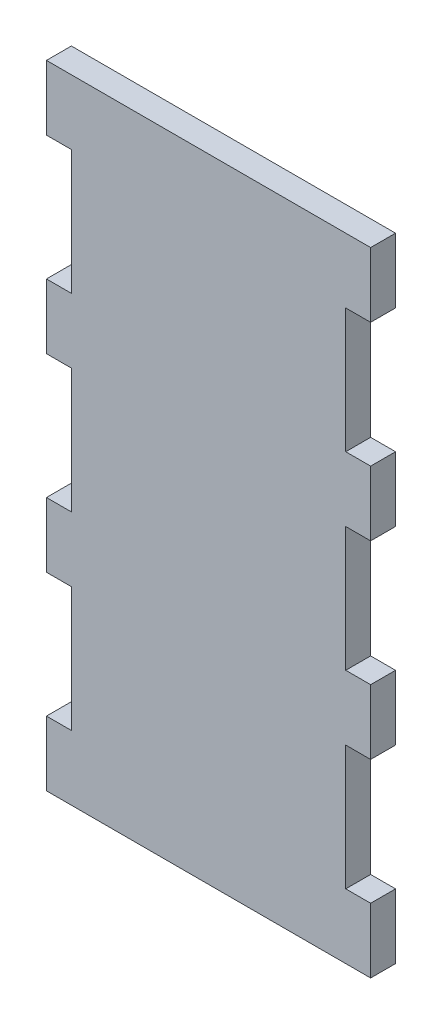
ISO-10303-21;
HEADER;
FILE_DESCRIPTION(('STEP AP214'),'2;1');
FILE_NAME('part.step','',(''),(''),'','','');
FILE_SCHEMA(('AUTOMOTIVE_DESIGN { 1 0 10303 214 1 1 1 1 }'));
ENDSEC;
DATA;
#1=APPLICATION_CONTEXT('core data for automotive mechanical design processes');
#2=APPLICATION_PROTOCOL_DEFINITION('international standard','automotive_design',2000,#1);
#3=PRODUCT_CONTEXT('',#1,'mechanical');
#4=PRODUCT('Part','Part','',(#3));
#5=PRODUCT_RELATED_PRODUCT_CATEGORY('part','',(#4));
#6=PRODUCT_DEFINITION_FORMATION('','',#4);
#7=PRODUCT_DEFINITION_CONTEXT('part definition',#1,'design');
#8=PRODUCT_DEFINITION('design','',#6,#7);
#9=PRODUCT_DEFINITION_SHAPE('','',#8);
#10=(LENGTH_UNIT() NAMED_UNIT(*) SI_UNIT(.MILLI.,.METRE.));
#11=(NAMED_UNIT(*) PLANE_ANGLE_UNIT() SI_UNIT($,.RADIAN.));
#12=(NAMED_UNIT(*) SI_UNIT($,.STERADIAN.) SOLID_ANGLE_UNIT());
#13=UNCERTAINTY_MEASURE_WITH_UNIT(LENGTH_MEASURE(1.E-05),#10,'distance_accuracy_value','');
#14=(GEOMETRIC_REPRESENTATION_CONTEXT(3) GLOBAL_UNCERTAINTY_ASSIGNED_CONTEXT((#13)) GLOBAL_UNIT_ASSIGNED_CONTEXT((#10,
#11,#12)) REPRESENTATION_CONTEXT('',''));
#15=CARTESIAN_POINT('',(0.,0.,0.));
#16=DIRECTION('',(0.,0.,1.));
#17=DIRECTION('',(1.,0.,0.));
#18=AXIS2_PLACEMENT_3D('',#15,#16,#17);
#19=CARTESIAN_POINT('',(-1.94346064814815,16.5420138888889,3.));
#20=DIRECTION('',(-1.,0.,0.));
#21=DIRECTION('',(0.,-1.,0.));
#22=AXIS2_PLACEMENT_3D('',#19,#20,#21);
#23=PLANE('',#22);
#24=DIRECTION('',(0.,1.,0.));
#25=VECTOR('',#24,1.);
#26=CARTESIAN_POINT('',(-1.94346064814815,16.5420138888889,0.));
#27=LINE('',#26,#25);
#28=CARTESIAN_POINT('',(-1.94346064814816,-36.8579861111111,0.));
#29=VERTEX_POINT('',#28);
#30=CARTESIAN_POINT('',(-1.94346064814816,-29.0579861111111,0.));
#31=VERTEX_POINT('',#30);
#32=EDGE_CURVE('E237',#29,#31,#27,.T.);
#33=ORIENTED_EDGE('',*,*,#32,.T.);
#34=DIRECTION('',(0.,0.,1.));
#35=VECTOR('',#34,1.);
#36=CARTESIAN_POINT('',(-1.94346064814816,-29.0579861111111,0.));
#37=LINE('',#36,#35);
#38=CARTESIAN_POINT('',(-1.94346064814816,-29.0579861111111,3.));
#39=VERTEX_POINT('',#38);
#40=EDGE_CURVE('E357',#31,#39,#37,.T.);
#41=ORIENTED_EDGE('',*,*,#40,.T.);
#42=DIRECTION('',(0.,1.,0.));
#43=VECTOR('',#42,1.);
#44=CARTESIAN_POINT('',(-1.94346064814815,16.5420138888889,3.));
#45=LINE('',#44,#43);
#46=CARTESIAN_POINT('',(-1.94346064814816,-36.8579861111111,3.));
#47=VERTEX_POINT('',#46);
#48=EDGE_CURVE('E239',#47,#39,#45,.T.);
#49=ORIENTED_EDGE('',*,*,#48,.F.);
#50=DIRECTION('',(0.,0.,1.));
#51=VECTOR('',#50,1.);
#52=CARTESIAN_POINT('',(-1.94346064814816,-36.8579861111111,0.));
#53=LINE('',#52,#51);
#54=EDGE_CURVE('E224',#29,#47,#53,.T.);
#55=ORIENTED_EDGE('',*,*,#54,.F.);
#56=EDGE_LOOP('',(#33,#41,#49,#55));
#57=FACE_BOUND('',#56,.T.);
#58=ADVANCED_FACE('F35',(#57),#23,.F.);
#59=CARTESIAN_POINT('',(-1.94346064814814,-59.6579861111111,0.));
#60=VERTEX_POINT('',#59);
#61=CARTESIAN_POINT('',(-1.94346064814816,-51.8579861111111,0.));
#62=VERTEX_POINT('',#61);
#63=EDGE_CURVE('E246',#60,#62,#27,.T.);
#64=ORIENTED_EDGE('',*,*,#63,.T.);
#65=DIRECTION('',(0.,0.,1.));
#66=VECTOR('',#65,1.);
#67=CARTESIAN_POINT('',(-1.94346064814816,-51.8579861111111,0.));
#68=LINE('',#67,#66);
#69=CARTESIAN_POINT('',(-1.94346064814816,-51.8579861111111,3.));
#70=VERTEX_POINT('',#69);
#71=EDGE_CURVE('E385',#62,#70,#68,.T.);
#72=ORIENTED_EDGE('',*,*,#71,.T.);
#73=CARTESIAN_POINT('',(-1.94346064814814,-59.6579861111111,3.));
#74=VERTEX_POINT('',#73);
#75=EDGE_CURVE('E273',#74,#70,#45,.T.);
#76=ORIENTED_EDGE('',*,*,#75,.F.);
#77=DIRECTION('',(0.,0.,-1.));
#78=VECTOR('',#77,1.);
#79=CARTESIAN_POINT('',(-1.94346064814814,-59.6579861111111,3.));
#80=LINE('',#79,#78);
#81=EDGE_CURVE('E43',#74,#60,#80,.T.);
#82=ORIENTED_EDGE('',*,*,#81,.T.);
#83=EDGE_LOOP('',(#64,#72,#76,#82));
#84=FACE_BOUND('',#83,.T.);
#85=ADVANCED_FACE('F433',(#84),#23,.F.);
#86=CARTESIAN_POINT('',(-40.9934606481482,16.5420138888889,3.));
#87=DIRECTION('',(1.,0.,0.));
#88=DIRECTION('',(0.,0.,-1.));
#89=AXIS2_PLACEMENT_3D('',#86,#87,#88);
#90=PLANE('',#89);
#91=DIRECTION('',(0.,-1.,0.));
#92=VECTOR('',#91,1.);
#93=CARTESIAN_POINT('',(-40.9934606481482,16.5420138888889,0.));
#94=LINE('',#93,#92);
#95=CARTESIAN_POINT('',(-40.9934606481481,-29.0579861111111,0.));
#96=VERTEX_POINT('',#95);
#97=CARTESIAN_POINT('',(-40.9934606481482,-36.8579861111111,0.));
#98=VERTEX_POINT('',#97);
#99=EDGE_CURVE('E478',#96,#98,#94,.T.);
#100=ORIENTED_EDGE('',*,*,#99,.T.);
#101=DIRECTION('',(0.,0.,1.));
#102=VECTOR('',#101,1.);
#103=CARTESIAN_POINT('',(-40.9934606481482,-36.8579861111111,0.));
#104=LINE('',#103,#102);
#105=CARTESIAN_POINT('',(-40.9934606481482,-36.8579861111111,3.));
#106=VERTEX_POINT('',#105);
#107=EDGE_CURVE('E372',#98,#106,#104,.T.);
#108=ORIENTED_EDGE('',*,*,#107,.T.);
#109=DIRECTION('',(0.,-1.,0.));
#110=VECTOR('',#109,1.);
#111=CARTESIAN_POINT('',(-40.9934606481482,16.5420138888889,3.));
#112=LINE('',#111,#110);
#113=CARTESIAN_POINT('',(-40.9934606481481,-29.0579861111111,3.));
#114=VERTEX_POINT('',#113);
#115=EDGE_CURVE('E449',#114,#106,#112,.T.);
#116=ORIENTED_EDGE('',*,*,#115,.F.);
#117=DIRECTION('',(0.,0.,1.));
#118=VECTOR('',#117,1.);
#119=CARTESIAN_POINT('',(-40.9934606481481,-29.0579861111111,0.));
#120=LINE('',#119,#118);
#121=EDGE_CURVE('E339',#96,#114,#120,.T.);
#122=ORIENTED_EDGE('',*,*,#121,.F.);
#123=EDGE_LOOP('',(#100,#108,#116,#122));
#124=FACE_BOUND('',#123,.T.);
#125=ADVANCED_FACE('F477',(#124),#90,.F.);
#126=CARTESIAN_POINT('',(-40.9934606481481,-6.25798611111111,0.));
#127=VERTEX_POINT('',#126);
#128=CARTESIAN_POINT('',(-40.9934606481482,-14.0579861111111,0.));
#129=VERTEX_POINT('',#128);
#130=EDGE_CURVE('E266',#127,#129,#94,.T.);
#131=ORIENTED_EDGE('',*,*,#130,.T.);
#132=DIRECTION('',(0.,0.,1.));
#133=VECTOR('',#132,1.);
#134=CARTESIAN_POINT('',(-40.9934606481482,-14.0579861111111,0.));
#135=LINE('',#134,#133);
#136=CARTESIAN_POINT('',(-40.9934606481482,-14.0579861111111,3.));
#137=VERTEX_POINT('',#136);
#138=EDGE_CURVE('E306',#129,#137,#135,.T.);
#139=ORIENTED_EDGE('',*,*,#138,.T.);
#140=CARTESIAN_POINT('',(-40.9934606481481,-6.25798611111111,3.));
#141=VERTEX_POINT('',#140);
#142=EDGE_CURVE('E283',#141,#137,#112,.T.);
#143=ORIENTED_EDGE('',*,*,#142,.F.);
#144=DIRECTION('',(0.,0.,1.));
#145=VECTOR('',#144,1.);
#146=CARTESIAN_POINT('',(-40.9934606481481,-6.25798611111111,0.));
#147=LINE('',#146,#145);
#148=EDGE_CURVE('E314',#127,#141,#147,.T.);
#149=ORIENTED_EDGE('',*,*,#148,.F.);
#150=EDGE_LOOP('',(#131,#139,#143,#149));
#151=FACE_BOUND('',#150,.T.);
#152=ADVANCED_FACE('F463',(#151),#90,.F.);
#153=CARTESIAN_POINT('',(-40.9934606481482,16.5420138888889,0.));
#154=VERTEX_POINT('',#153);
#155=CARTESIAN_POINT('',(-40.9934606481482,8.74201388888889,0.));
#156=VERTEX_POINT('',#155);
#157=EDGE_CURVE('E260',#154,#156,#94,.T.);
#158=ORIENTED_EDGE('',*,*,#157,.T.);
#159=DIRECTION('',(0.,0.,1.));
#160=VECTOR('',#159,1.);
#161=CARTESIAN_POINT('',(-40.9934606481482,8.74201388888889,0.));
#162=LINE('',#161,#160);
#163=CARTESIAN_POINT('',(-40.9934606481482,8.74201388888889,3.));
#164=VERTEX_POINT('',#163);
#165=EDGE_CURVE('E321',#156,#164,#162,.T.);
#166=ORIENTED_EDGE('',*,*,#165,.T.);
#167=CARTESIAN_POINT('',(-40.9934606481482,16.5420138888889,3.));
#168=VERTEX_POINT('',#167);
#169=EDGE_CURVE('E280',#168,#164,#112,.T.);
#170=ORIENTED_EDGE('',*,*,#169,.F.);
#171=DIRECTION('',(0.,0.,-1.));
#172=VECTOR('',#171,1.);
#173=CARTESIAN_POINT('',(-40.9934606481482,16.5420138888889,3.));
#174=LINE('',#173,#172);
#175=EDGE_CURVE('E272',#168,#154,#174,.T.);
#176=ORIENTED_EDGE('',*,*,#175,.T.);
#177=EDGE_LOOP('',(#158,#166,#170,#176));
#178=FACE_BOUND('',#177,.T.);
#179=ADVANCED_FACE('F489',(#178),#90,.F.);
#180=CARTESIAN_POINT('',(-1.94346064814816,-14.0579861111111,3.));
#181=VERTEX_POINT('',#180);
#182=CARTESIAN_POINT('',(-1.94346064814815,-6.25798611111111,3.));
#183=VERTEX_POINT('',#182);
#184=EDGE_CURVE('E276',#181,#183,#45,.T.);
#185=ORIENTED_EDGE('',*,*,#184,.F.);
#186=DIRECTION('',(0.,0.,1.));
#187=VECTOR('',#186,1.);
#188=CARTESIAN_POINT('',(-1.94346064814816,-14.0579861111111,0.));
#189=LINE('',#188,#187);
#190=CARTESIAN_POINT('',(-1.94346064814816,-14.0579861111111,0.));
#191=VERTEX_POINT('',#190);
#192=EDGE_CURVE('E391',#191,#181,#189,.T.);
#193=ORIENTED_EDGE('',*,*,#192,.F.);
#194=CARTESIAN_POINT('',(-1.94346064814815,-6.25798611111111,0.));
#195=VERTEX_POINT('',#194);
#196=EDGE_CURVE('E247',#191,#195,#27,.T.);
#197=ORIENTED_EDGE('',*,*,#196,.T.);
#198=DIRECTION('',(0.,0.,1.));
#199=VECTOR('',#198,1.);
#200=CARTESIAN_POINT('',(-1.94346064814815,-6.25798611111111,0.));
#201=LINE('',#200,#199);
#202=EDGE_CURVE('E292',#195,#183,#201,.T.);
#203=ORIENTED_EDGE('',*,*,#202,.T.);
#204=EDGE_LOOP('',(#185,#193,#197,#203));
#205=FACE_BOUND('',#204,.T.);
#206=ADVANCED_FACE('F488',(#205),#23,.F.);
#207=CARTESIAN_POINT('',(-40.9934606481482,-51.8579861111111,3.));
#208=VERTEX_POINT('',#207);
#209=CARTESIAN_POINT('',(-40.9934606481482,-59.6579861111111,3.));
#210=VERTEX_POINT('',#209);
#211=EDGE_CURVE('E284',#208,#210,#112,.T.);
#212=ORIENTED_EDGE('',*,*,#211,.F.);
#213=DIRECTION('',(0.,0.,1.));
#214=VECTOR('',#213,1.);
#215=CARTESIAN_POINT('',(-40.9934606481482,-51.8579861111111,0.));
#216=LINE('',#215,#214);
#217=CARTESIAN_POINT('',(-40.9934606481482,-51.8579861111111,0.));
#218=VERTEX_POINT('',#217);
#219=EDGE_CURVE('E365',#218,#208,#216,.T.);
#220=ORIENTED_EDGE('',*,*,#219,.F.);
#221=CARTESIAN_POINT('',(-40.9934606481482,-59.6579861111111,0.));
#222=VERTEX_POINT('',#221);
#223=EDGE_CURVE('E268',#218,#222,#94,.T.);
#224=ORIENTED_EDGE('',*,*,#223,.T.);
#225=DIRECTION('',(0.,0.,-1.));
#226=VECTOR('',#225,1.);
#227=CARTESIAN_POINT('',(-40.9934606481482,-59.6579861111111,3.));
#228=LINE('',#227,#226);
#229=EDGE_CURVE('E11',#210,#222,#228,.T.);
#230=ORIENTED_EDGE('',*,*,#229,.F.);
#231=EDGE_LOOP('',(#212,#220,#224,#230));
#232=FACE_BOUND('',#231,.T.);
#233=ADVANCED_FACE('F37',(#232),#90,.F.);
#234=CARTESIAN_POINT('',(-40.9934606481482,-59.6579861111111,3.));
#235=DIRECTION('',(0.,1.,0.));
#236=DIRECTION('',(0.,0.,1.));
#237=AXIS2_PLACEMENT_3D('',#234,#235,#236);
#238=PLANE('',#237);
#239=DIRECTION('',(1.,0.,0.));
#240=VECTOR('',#239,1.);
#241=CARTESIAN_POINT('',(-40.9934606481482,-59.6579861111111,0.));
#242=LINE('',#241,#240);
#243=EDGE_CURVE('E254',#222,#60,#242,.T.);
#244=ORIENTED_EDGE('',*,*,#243,.T.);
#245=ORIENTED_EDGE('',*,*,#81,.F.);
#246=DIRECTION('',(1.,0.,0.));
#247=VECTOR('',#246,1.);
#248=CARTESIAN_POINT('',(-40.9934606481482,-59.6579861111111,3.));
#249=LINE('',#248,#247);
#250=EDGE_CURVE('E278',#210,#74,#249,.T.);
#251=ORIENTED_EDGE('',*,*,#250,.F.);
#252=ORIENTED_EDGE('',*,*,#229,.T.);
#253=EDGE_LOOP('',(#244,#245,#251,#252));
#254=FACE_BOUND('',#253,.T.);
#255=ADVANCED_FACE('F441',(#254),#238,.F.);
#256=CARTESIAN_POINT('',(-1.94346064814815,8.74201388888888,3.));
#257=VERTEX_POINT('',#256);
#258=CARTESIAN_POINT('',(-1.94346064814815,16.5420138888889,3.));
#259=VERTEX_POINT('',#258);
#260=EDGE_CURVE('E277',#257,#259,#45,.T.);
#261=ORIENTED_EDGE('',*,*,#260,.F.);
#262=DIRECTION('',(0.,0.,1.));
#263=VECTOR('',#262,1.);
#264=CARTESIAN_POINT('',(-1.94346064814815,8.74201388888888,0.));
#265=LINE('',#264,#263);
#266=CARTESIAN_POINT('',(-1.94346064814815,8.74201388888888,0.));
#267=VERTEX_POINT('',#266);
#268=EDGE_CURVE('E285',#267,#257,#265,.T.);
#269=ORIENTED_EDGE('',*,*,#268,.F.);
#270=CARTESIAN_POINT('',(-1.94346064814815,16.5420138888889,0.));
#271=VERTEX_POINT('',#270);
#272=EDGE_CURVE('E249',#267,#271,#27,.T.);
#273=ORIENTED_EDGE('',*,*,#272,.T.);
#274=DIRECTION('',(0.,0.,-1.));
#275=VECTOR('',#274,1.);
#276=CARTESIAN_POINT('',(-1.94346064814815,16.5420138888889,3.));
#277=LINE('',#276,#275);
#278=EDGE_CURVE('E442',#259,#271,#277,.T.);
#279=ORIENTED_EDGE('',*,*,#278,.F.);
#280=EDGE_LOOP('',(#261,#269,#273,#279));
#281=FACE_BOUND('',#280,.T.);
#282=ADVANCED_FACE('F494',(#281),#23,.F.);
#283=CARTESIAN_POINT('',(-40.9934606481482,16.5420138888889,3.));
#284=DIRECTION('',(0.,-1.,0.));
#285=DIRECTION('',(0.,0.,-1.));
#286=AXIS2_PLACEMENT_3D('',#283,#284,#285);
#287=PLANE('',#286);
#288=DIRECTION('',(-1.,0.,0.));
#289=VECTOR('',#288,1.);
#290=CARTESIAN_POINT('',(-40.9934606481482,16.5420138888889,0.));
#291=LINE('',#290,#289);
#292=EDGE_CURVE('E251',#271,#154,#291,.T.);
#293=ORIENTED_EDGE('',*,*,#292,.T.);
#294=ORIENTED_EDGE('',*,*,#175,.F.);
#295=DIRECTION('',(-1.,0.,0.));
#296=VECTOR('',#295,1.);
#297=CARTESIAN_POINT('',(-40.9934606481482,16.5420138888889,3.));
#298=LINE('',#297,#296);
#299=EDGE_CURVE('E270',#259,#168,#298,.T.);
#300=ORIENTED_EDGE('',*,*,#299,.F.);
#301=ORIENTED_EDGE('',*,*,#278,.T.);
#302=EDGE_LOOP('',(#293,#294,#300,#301));
#303=FACE_BOUND('',#302,.T.);
#304=ADVANCED_FACE('F506',(#303),#287,.F.);
#305=CARTESIAN_POINT('',(0.,0.,3.));
#306=DIRECTION('',(0.,0.,1.));
#307=DIRECTION('',(1.,0.,0.));
#308=AXIS2_PLACEMENT_3D('',#305,#306,#307);
#309=PLANE('',#308);
#310=DIRECTION('',(1.,0.,0.));
#311=VECTOR('',#310,1.);
#312=CARTESIAN_POINT('',(-1.94346064814816,-29.0579861111111,3.));
#313=LINE('',#312,#311);
#314=CARTESIAN_POINT('',(-4.94346064814814,-29.0579861111111,3.));
#315=VERTEX_POINT('',#314);
#316=EDGE_CURVE('E398',#315,#39,#313,.T.);
#317=ORIENTED_EDGE('',*,*,#316,.F.);
#318=DIRECTION('',(0.,-1.,0.));
#319=VECTOR('',#318,1.);
#320=CARTESIAN_POINT('',(-4.94346064814814,-14.0579861111111,3.));
#321=LINE('',#320,#319);
#322=CARTESIAN_POINT('',(-4.94346064814814,-14.0579861111111,3.));
#323=VERTEX_POINT('',#322);
#324=EDGE_CURVE('E401',#323,#315,#321,.T.);
#325=ORIENTED_EDGE('',*,*,#324,.F.);
#326=DIRECTION('',(-1.,0.,0.));
#327=VECTOR('',#326,1.);
#328=CARTESIAN_POINT('',(-1.94346064814816,-14.0579861111111,3.));
#329=LINE('',#328,#327);
#330=EDGE_CURVE('E375',#181,#323,#329,.T.);
#331=ORIENTED_EDGE('',*,*,#330,.F.);
#332=ORIENTED_EDGE('',*,*,#184,.T.);
#333=DIRECTION('',(1.,0.,0.));
#334=VECTOR('',#333,1.);
#335=CARTESIAN_POINT('',(-1.94346064814815,-6.25798611111111,3.));
#336=LINE('',#335,#334);
#337=CARTESIAN_POINT('',(-4.94346064814814,-6.25798611111111,3.));
#338=VERTEX_POINT('',#337);
#339=EDGE_CURVE('E296',#338,#183,#336,.T.);
#340=ORIENTED_EDGE('',*,*,#339,.F.);
#341=DIRECTION('',(0.,-1.,0.));
#342=VECTOR('',#341,1.);
#343=CARTESIAN_POINT('',(-4.94346064814814,8.74201388888888,3.));
#344=LINE('',#343,#342);
#345=CARTESIAN_POINT('',(-4.94346064814814,8.74201388888888,3.));
#346=VERTEX_POINT('',#345);
#347=EDGE_CURVE('E300',#346,#338,#344,.T.);
#348=ORIENTED_EDGE('',*,*,#347,.F.);
#349=DIRECTION('',(-1.,0.,0.));
#350=VECTOR('',#349,1.);
#351=CARTESIAN_POINT('',(-1.94346064814815,8.74201388888888,3.));
#352=LINE('',#351,#350);
#353=EDGE_CURVE('E303',#257,#346,#352,.T.);
#354=ORIENTED_EDGE('',*,*,#353,.F.);
#355=ORIENTED_EDGE('',*,*,#260,.T.);
#356=ORIENTED_EDGE('',*,*,#299,.T.);
#357=ORIENTED_EDGE('',*,*,#169,.T.);
#358=DIRECTION('',(-1.,0.,0.));
#359=VECTOR('',#358,1.);
#360=CARTESIAN_POINT('',(-40.9934606481482,8.74201388888889,3.));
#361=LINE('',#360,#359);
#362=CARTESIAN_POINT('',(-37.9934606481481,8.74201388888889,3.));
#363=VERTEX_POINT('',#362);
#364=EDGE_CURVE('E324',#363,#164,#361,.T.);
#365=ORIENTED_EDGE('',*,*,#364,.F.);
#366=DIRECTION('',(0.,1.,0.));
#367=VECTOR('',#366,1.);
#368=CARTESIAN_POINT('',(-37.9934606481481,8.74201388888889,3.));
#369=LINE('',#368,#367);
#370=CARTESIAN_POINT('',(-37.9934606481481,-6.25798611111111,3.));
#371=VERTEX_POINT('',#370);
#372=EDGE_CURVE('E327',#371,#363,#369,.T.);
#373=ORIENTED_EDGE('',*,*,#372,.F.);
#374=DIRECTION('',(1.,0.,0.));
#375=VECTOR('',#374,1.);
#376=CARTESIAN_POINT('',(-40.9934606481481,-6.25798611111111,3.));
#377=LINE('',#376,#375);
#378=EDGE_CURVE('E295',#141,#371,#377,.T.);
#379=ORIENTED_EDGE('',*,*,#378,.F.);
#380=ORIENTED_EDGE('',*,*,#142,.T.);
#381=DIRECTION('',(-1.,0.,0.));
#382=VECTOR('',#381,1.);
#383=CARTESIAN_POINT('',(-40.9934606481482,-14.0579861111111,3.));
#384=LINE('',#383,#382);
#385=CARTESIAN_POINT('',(-37.9934606481481,-14.0579861111111,3.));
#386=VERTEX_POINT('',#385);
#387=EDGE_CURVE('E348',#386,#137,#384,.T.);
#388=ORIENTED_EDGE('',*,*,#387,.F.);
#389=DIRECTION('',(0.,1.,0.));
#390=VECTOR('',#389,1.);
#391=CARTESIAN_POINT('',(-37.9934606481481,-14.0579861111111,3.));
#392=LINE('',#391,#390);
#393=CARTESIAN_POINT('',(-37.9934606481481,-29.0579861111111,3.));
#394=VERTEX_POINT('',#393);
#395=EDGE_CURVE('E351',#394,#386,#392,.T.);
#396=ORIENTED_EDGE('',*,*,#395,.F.);
#397=DIRECTION('',(1.,0.,0.));
#398=VECTOR('',#397,1.);
#399=CARTESIAN_POINT('',(-40.9934606481481,-29.0579861111111,3.));
#400=LINE('',#399,#398);
#401=EDGE_CURVE('E354',#114,#394,#400,.T.);
#402=ORIENTED_EDGE('',*,*,#401,.F.);
#403=ORIENTED_EDGE('',*,*,#115,.T.);
#404=DIRECTION('',(-1.,0.,0.));
#405=VECTOR('',#404,1.);
#406=CARTESIAN_POINT('',(-40.9934606481482,-36.8579861111111,3.));
#407=LINE('',#406,#405);
#408=CARTESIAN_POINT('',(-37.9934606481482,-36.8579861111111,3.));
#409=VERTEX_POINT('',#408);
#410=EDGE_CURVE('E376',#409,#106,#407,.T.);
#411=ORIENTED_EDGE('',*,*,#410,.F.);
#412=DIRECTION('',(0.,1.,0.));
#413=VECTOR('',#412,1.);
#414=CARTESIAN_POINT('',(-37.9934606481482,-36.8579861111111,3.));
#415=LINE('',#414,#413);
#416=CARTESIAN_POINT('',(-37.9934606481482,-51.8579861111111,3.));
#417=VERTEX_POINT('',#416);
#418=EDGE_CURVE('E379',#417,#409,#415,.T.);
#419=ORIENTED_EDGE('',*,*,#418,.F.);
#420=DIRECTION('',(1.,0.,0.));
#421=VECTOR('',#420,1.);
#422=CARTESIAN_POINT('',(-40.9934606481482,-51.8579861111111,3.));
#423=LINE('',#422,#421);
#424=EDGE_CURVE('E382',#208,#417,#423,.T.);
#425=ORIENTED_EDGE('',*,*,#424,.F.);
#426=ORIENTED_EDGE('',*,*,#211,.T.);
#427=ORIENTED_EDGE('',*,*,#250,.T.);
#428=ORIENTED_EDGE('',*,*,#75,.T.);
#429=DIRECTION('',(1.,0.,0.));
#430=VECTOR('',#429,1.);
#431=CARTESIAN_POINT('',(-1.94346064814816,-51.8579861111111,3.));
#432=LINE('',#431,#430);
#433=CARTESIAN_POINT('',(-4.94346064814815,-51.8579861111111,3.));
#434=VERTEX_POINT('',#433);
#435=EDGE_CURVE('E231',#434,#70,#432,.T.);
#436=ORIENTED_EDGE('',*,*,#435,.F.);
#437=DIRECTION('',(0.,-1.,0.));
#438=VECTOR('',#437,1.);
#439=CARTESIAN_POINT('',(-4.94346064814815,-36.8579861111111,3.));
#440=LINE('',#439,#438);
#441=CARTESIAN_POINT('',(-4.94346064814815,-36.8579861111111,3.));
#442=VERTEX_POINT('',#441);
#443=EDGE_CURVE('E416',#442,#434,#440,.T.);
#444=ORIENTED_EDGE('',*,*,#443,.F.);
#445=DIRECTION('',(-1.,0.,0.));
#446=VECTOR('',#445,1.);
#447=CARTESIAN_POINT('',(-1.94346064814816,-36.8579861111111,3.));
#448=LINE('',#447,#446);
#449=EDGE_CURVE('E419',#47,#442,#448,.T.);
#450=ORIENTED_EDGE('',*,*,#449,.F.);
#451=ORIENTED_EDGE('',*,*,#48,.T.);
#452=EDGE_LOOP('',(#317,#325,#331,#332,#340,#348,#354,#355,#356,#357,#365,#373,#379,#380,#388,
#396,#402,#403,#411,#419,#425,#426,#427,#428,#436,#444,#450,#451));
#453=FACE_BOUND('',#452,.T.);
#454=ADVANCED_FACE('F436',(#453),#309,.T.);
#455=CARTESIAN_POINT('',(0.,0.,0.));
#456=DIRECTION('',(0.,0.,1.));
#457=DIRECTION('',(1.,0.,0.));
#458=AXIS2_PLACEMENT_3D('',#455,#456,#457);
#459=PLANE('',#458);
#460=DIRECTION('',(0.,-1.,0.));
#461=VECTOR('',#460,1.);
#462=CARTESIAN_POINT('',(-4.94346064814814,-14.0579861111111,0.));
#463=LINE('',#462,#461);
#464=CARTESIAN_POINT('',(-4.94346064814814,-14.0579861111111,0.));
#465=VERTEX_POINT('',#464);
#466=CARTESIAN_POINT('',(-4.94346064814814,-29.0579861111111,0.));
#467=VERTEX_POINT('',#466);
#468=EDGE_CURVE('E50',#465,#467,#463,.T.);
#469=ORIENTED_EDGE('',*,*,#468,.T.);
#470=DIRECTION('',(1.,0.,0.));
#471=VECTOR('',#470,1.);
#472=CARTESIAN_POINT('',(-1.94346064814816,-29.0579861111111,0.));
#473=LINE('',#472,#471);
#474=EDGE_CURVE('E245',#467,#31,#473,.T.);
#475=ORIENTED_EDGE('',*,*,#474,.T.);
#476=ORIENTED_EDGE('',*,*,#32,.F.);
#477=DIRECTION('',(-1.,0.,0.));
#478=VECTOR('',#477,1.);
#479=CARTESIAN_POINT('',(-1.94346064814816,-36.8579861111111,0.));
#480=LINE('',#479,#478);
#481=CARTESIAN_POINT('',(-4.94346064814815,-36.8579861111111,0.));
#482=VERTEX_POINT('',#481);
#483=EDGE_CURVE('E220',#29,#482,#480,.T.);
#484=ORIENTED_EDGE('',*,*,#483,.T.);
#485=DIRECTION('',(0.,-1.,0.));
#486=VECTOR('',#485,1.);
#487=CARTESIAN_POINT('',(-4.94346064814815,-36.8579861111111,0.));
#488=LINE('',#487,#486);
#489=CARTESIAN_POINT('',(-4.94346064814815,-51.8579861111111,0.));
#490=VERTEX_POINT('',#489);
#491=EDGE_CURVE('E230',#482,#490,#488,.T.);
#492=ORIENTED_EDGE('',*,*,#491,.T.);
#493=DIRECTION('',(1.,0.,0.));
#494=VECTOR('',#493,1.);
#495=CARTESIAN_POINT('',(-1.94346064814816,-51.8579861111111,0.));
#496=LINE('',#495,#494);
#497=EDGE_CURVE('E240',#490,#62,#496,.T.);
#498=ORIENTED_EDGE('',*,*,#497,.T.);
#499=ORIENTED_EDGE('',*,*,#63,.F.);
#500=ORIENTED_EDGE('',*,*,#243,.F.);
#501=ORIENTED_EDGE('',*,*,#223,.F.);
#502=DIRECTION('',(1.,0.,0.));
#503=VECTOR('',#502,1.);
#504=CARTESIAN_POINT('',(-40.9934606481482,-51.8579861111111,0.));
#505=LINE('',#504,#503);
#506=CARTESIAN_POINT('',(-37.9934606481482,-51.8579861111111,0.));
#507=VERTEX_POINT('',#506);
#508=EDGE_CURVE('E378',#218,#507,#505,.T.);
#509=ORIENTED_EDGE('',*,*,#508,.T.);
#510=DIRECTION('',(0.,1.,0.));
#511=VECTOR('',#510,1.);
#512=CARTESIAN_POINT('',(-37.9934606481482,-36.8579861111111,0.));
#513=LINE('',#512,#511);
#514=CARTESIAN_POINT('',(-37.9934606481482,-36.8579861111111,0.));
#515=VERTEX_POINT('',#514);
#516=EDGE_CURVE('E58',#507,#515,#513,.T.);
#517=ORIENTED_EDGE('',*,*,#516,.T.);
#518=DIRECTION('',(-1.,0.,0.));
#519=VECTOR('',#518,1.);
#520=CARTESIAN_POINT('',(-40.9934606481482,-36.8579861111111,0.));
#521=LINE('',#520,#519);
#522=EDGE_CURVE('E368',#515,#98,#521,.T.);
#523=ORIENTED_EDGE('',*,*,#522,.T.);
#524=ORIENTED_EDGE('',*,*,#99,.F.);
#525=DIRECTION('',(1.,0.,0.));
#526=VECTOR('',#525,1.);
#527=CARTESIAN_POINT('',(-40.9934606481481,-29.0579861111111,0.));
#528=LINE('',#527,#526);
#529=CARTESIAN_POINT('',(-37.9934606481481,-29.0579861111111,0.));
#530=VERTEX_POINT('',#529);
#531=EDGE_CURVE('E350',#96,#530,#528,.T.);
#532=ORIENTED_EDGE('',*,*,#531,.T.);
#533=DIRECTION('',(0.,1.,0.));
#534=VECTOR('',#533,1.);
#535=CARTESIAN_POINT('',(-37.9934606481481,-14.0579861111111,0.));
#536=LINE('',#535,#534);
#537=CARTESIAN_POINT('',(-37.9934606481481,-14.0579861111111,0.));
#538=VERTEX_POINT('',#537);
#539=EDGE_CURVE('E360',#530,#538,#536,.T.);
#540=ORIENTED_EDGE('',*,*,#539,.T.);
#541=DIRECTION('',(-1.,0.,0.));
#542=VECTOR('',#541,1.);
#543=CARTESIAN_POINT('',(-40.9934606481482,-14.0579861111111,0.));
#544=LINE('',#543,#542);
#545=EDGE_CURVE('E342',#538,#129,#544,.T.);
#546=ORIENTED_EDGE('',*,*,#545,.T.);
#547=ORIENTED_EDGE('',*,*,#130,.F.);
#548=DIRECTION('',(1.,0.,0.));
#549=VECTOR('',#548,1.);
#550=CARTESIAN_POINT('',(-40.9934606481481,-6.25798611111111,0.));
#551=LINE('',#550,#549);
#552=CARTESIAN_POINT('',(-37.9934606481481,-6.25798611111111,0.));
#553=VERTEX_POINT('',#552);
#554=EDGE_CURVE('E326',#127,#553,#551,.T.);
#555=ORIENTED_EDGE('',*,*,#554,.T.);
#556=DIRECTION('',(0.,1.,0.));
#557=VECTOR('',#556,1.);
#558=CARTESIAN_POINT('',(-37.9934606481481,8.74201388888889,0.));
#559=LINE('',#558,#557);
#560=CARTESIAN_POINT('',(-37.9934606481481,8.74201388888889,0.));
#561=VERTEX_POINT('',#560);
#562=EDGE_CURVE('E334',#553,#561,#559,.T.);
#563=ORIENTED_EDGE('',*,*,#562,.T.);
#564=DIRECTION('',(-1.,0.,0.));
#565=VECTOR('',#564,1.);
#566=CARTESIAN_POINT('',(-40.9934606481482,8.74201388888889,0.));
#567=LINE('',#566,#565);
#568=EDGE_CURVE('E317',#561,#156,#567,.T.);
#569=ORIENTED_EDGE('',*,*,#568,.T.);
#570=ORIENTED_EDGE('',*,*,#157,.F.);
#571=ORIENTED_EDGE('',*,*,#292,.F.);
#572=ORIENTED_EDGE('',*,*,#272,.F.);
#573=DIRECTION('',(-1.,0.,0.));
#574=VECTOR('',#573,1.);
#575=CARTESIAN_POINT('',(-1.94346064814815,8.74201388888888,0.));
#576=LINE('',#575,#574);
#577=CARTESIAN_POINT('',(-4.94346064814814,8.74201388888888,0.));
#578=VERTEX_POINT('',#577);
#579=EDGE_CURVE('E299',#267,#578,#576,.T.);
#580=ORIENTED_EDGE('',*,*,#579,.T.);
#581=DIRECTION('',(0.,-1.,0.));
#582=VECTOR('',#581,1.);
#583=CARTESIAN_POINT('',(-4.94346064814814,8.74201388888888,0.));
#584=LINE('',#583,#582);
#585=CARTESIAN_POINT('',(-4.94346064814814,-6.25798611111111,0.));
#586=VERTEX_POINT('',#585);
#587=EDGE_CURVE('E309',#578,#586,#584,.T.);
#588=ORIENTED_EDGE('',*,*,#587,.T.);
#589=DIRECTION('',(1.,0.,0.));
#590=VECTOR('',#589,1.);
#591=CARTESIAN_POINT('',(-1.94346064814815,-6.25798611111111,0.));
#592=LINE('',#591,#590);
#593=EDGE_CURVE('E288',#586,#195,#592,.T.);
#594=ORIENTED_EDGE('',*,*,#593,.T.);
#595=ORIENTED_EDGE('',*,*,#196,.F.);
#596=DIRECTION('',(-1.,0.,0.));
#597=VECTOR('',#596,1.);
#598=CARTESIAN_POINT('',(-1.94346064814816,-14.0579861111111,0.));
#599=LINE('',#598,#597);
#600=EDGE_CURVE('E400',#191,#465,#599,.T.);
#601=ORIENTED_EDGE('',*,*,#600,.T.);
#602=EDGE_LOOP('',(#469,#475,#476,#484,#492,#498,#499,#500,#501,#509,#517,#523,#524,#532,#540,
#546,#547,#555,#563,#569,#570,#571,#572,#580,#588,#594,#595,#601));
#603=FACE_BOUND('',#602,.T.);
#604=ADVANCED_FACE('F243',(#603),#459,.F.);
#605=CARTESIAN_POINT('',(-1.94346064814815,-6.25798611111111,0.));
#606=DIRECTION('',(0.,-1.,0.));
#607=DIRECTION('',(0.,0.,-1.));
#608=AXIS2_PLACEMENT_3D('',#605,#606,#607);
#609=PLANE('',#608);
#610=ORIENTED_EDGE('',*,*,#339,.T.);
#611=ORIENTED_EDGE('',*,*,#202,.F.);
#612=ORIENTED_EDGE('',*,*,#593,.F.);
#613=DIRECTION('',(0.,0.,1.));
#614=VECTOR('',#613,1.);
#615=CARTESIAN_POINT('',(-4.94346064814814,-6.25798611111111,0.));
#616=LINE('',#615,#614);
#617=EDGE_CURVE('E290',#586,#338,#616,.T.);
#618=ORIENTED_EDGE('',*,*,#617,.T.);
#619=EDGE_LOOP('',(#610,#611,#612,#618));
#620=FACE_BOUND('',#619,.T.);
#621=ADVANCED_FACE('F527',(#620),#609,.F.);
#622=CARTESIAN_POINT('',(-4.94346064814814,8.74201388888888,0.));
#623=DIRECTION('',(-1.,0.,0.));
#624=DIRECTION('',(0.,-1.,0.));
#625=AXIS2_PLACEMENT_3D('',#622,#623,#624);
#626=PLANE('',#625);
#627=ORIENTED_EDGE('',*,*,#347,.T.);
#628=ORIENTED_EDGE('',*,*,#617,.F.);
#629=ORIENTED_EDGE('',*,*,#587,.F.);
#630=DIRECTION('',(0.,0.,1.));
#631=VECTOR('',#630,1.);
#632=CARTESIAN_POINT('',(-4.94346064814814,8.74201388888888,0.));
#633=LINE('',#632,#631);
#634=EDGE_CURVE('E287',#578,#346,#633,.T.);
#635=ORIENTED_EDGE('',*,*,#634,.T.);
#636=EDGE_LOOP('',(#627,#628,#629,#635));
#637=FACE_BOUND('',#636,.T.);
#638=ADVANCED_FACE('F530',(#637),#626,.F.);
#639=CARTESIAN_POINT('',(-1.94346064814815,8.74201388888888,0.));
#640=DIRECTION('',(0.,1.,0.));
#641=DIRECTION('',(0.,0.,1.));
#642=AXIS2_PLACEMENT_3D('',#639,#640,#641);
#643=PLANE('',#642);
#644=ORIENTED_EDGE('',*,*,#353,.T.);
#645=ORIENTED_EDGE('',*,*,#634,.F.);
#646=ORIENTED_EDGE('',*,*,#579,.F.);
#647=ORIENTED_EDGE('',*,*,#268,.T.);
#648=EDGE_LOOP('',(#644,#645,#646,#647));
#649=FACE_BOUND('',#648,.T.);
#650=ADVANCED_FACE('F532',(#649),#643,.F.);
#651=CARTESIAN_POINT('',(-40.9934606481482,8.74201388888889,0.));
#652=DIRECTION('',(0.,1.,0.));
#653=DIRECTION('',(0.,0.,1.));
#654=AXIS2_PLACEMENT_3D('',#651,#652,#653);
#655=PLANE('',#654);
#656=ORIENTED_EDGE('',*,*,#364,.T.);
#657=ORIENTED_EDGE('',*,*,#165,.F.);
#658=ORIENTED_EDGE('',*,*,#568,.F.);
#659=DIRECTION('',(0.,0.,1.));
#660=VECTOR('',#659,1.);
#661=CARTESIAN_POINT('',(-37.9934606481481,8.74201388888889,0.));
#662=LINE('',#661,#660);
#663=EDGE_CURVE('E319',#561,#363,#662,.T.);
#664=ORIENTED_EDGE('',*,*,#663,.T.);
#665=EDGE_LOOP('',(#656,#657,#658,#664));
#666=FACE_BOUND('',#665,.T.);
#667=ADVANCED_FACE('F535',(#666),#655,.F.);
#668=CARTESIAN_POINT('',(-37.9934606481481,8.74201388888889,0.));
#669=DIRECTION('',(1.,0.,0.));
#670=DIRECTION('',(0.,0.,-1.));
#671=AXIS2_PLACEMENT_3D('',#668,#669,#670);
#672=PLANE('',#671);
#673=ORIENTED_EDGE('',*,*,#372,.T.);
#674=ORIENTED_EDGE('',*,*,#663,.F.);
#675=ORIENTED_EDGE('',*,*,#562,.F.);
#676=DIRECTION('',(0.,0.,1.));
#677=VECTOR('',#676,1.);
#678=CARTESIAN_POINT('',(-37.9934606481481,-6.25798611111111,0.));
#679=LINE('',#678,#677);
#680=EDGE_CURVE('E316',#553,#371,#679,.T.);
#681=ORIENTED_EDGE('',*,*,#680,.T.);
#682=EDGE_LOOP('',(#673,#674,#675,#681));
#683=FACE_BOUND('',#682,.T.);
#684=ADVANCED_FACE('F541',(#683),#672,.F.);
#685=CARTESIAN_POINT('',(-40.9934606481481,-6.25798611111111,0.));
#686=DIRECTION('',(0.,-1.,0.));
#687=DIRECTION('',(1.,0.,0.));
#688=AXIS2_PLACEMENT_3D('',#685,#686,#687);
#689=PLANE('',#688);
#690=ORIENTED_EDGE('',*,*,#378,.T.);
#691=ORIENTED_EDGE('',*,*,#680,.F.);
#692=ORIENTED_EDGE('',*,*,#554,.F.);
#693=ORIENTED_EDGE('',*,*,#148,.T.);
#694=EDGE_LOOP('',(#690,#691,#692,#693));
#695=FACE_BOUND('',#694,.T.);
#696=ADVANCED_FACE('F556',(#695),#689,.F.);
#697=CARTESIAN_POINT('',(-40.9934606481482,-14.0579861111111,0.));
#698=DIRECTION('',(0.,1.,0.));
#699=DIRECTION('',(0.,0.,1.));
#700=AXIS2_PLACEMENT_3D('',#697,#698,#699);
#701=PLANE('',#700);
#702=ORIENTED_EDGE('',*,*,#387,.T.);
#703=ORIENTED_EDGE('',*,*,#138,.F.);
#704=ORIENTED_EDGE('',*,*,#545,.F.);
#705=DIRECTION('',(0.,0.,1.));
#706=VECTOR('',#705,1.);
#707=CARTESIAN_POINT('',(-37.9934606481481,-14.0579861111111,0.));
#708=LINE('',#707,#706);
#709=EDGE_CURVE('E344',#538,#386,#708,.T.);
#710=ORIENTED_EDGE('',*,*,#709,.T.);
#711=EDGE_LOOP('',(#702,#703,#704,#710));
#712=FACE_BOUND('',#711,.T.);
#713=ADVANCED_FACE('F467',(#712),#701,.F.);
#714=CARTESIAN_POINT('',(-37.9934606481481,-14.0579861111111,0.));
#715=DIRECTION('',(1.,0.,0.));
#716=DIRECTION('',(0.,0.,-1.));
#717=AXIS2_PLACEMENT_3D('',#714,#715,#716);
#718=PLANE('',#717);
#719=ORIENTED_EDGE('',*,*,#395,.T.);
#720=ORIENTED_EDGE('',*,*,#709,.F.);
#721=ORIENTED_EDGE('',*,*,#539,.F.);
#722=DIRECTION('',(0.,0.,1.));
#723=VECTOR('',#722,1.);
#724=CARTESIAN_POINT('',(-37.9934606481481,-29.0579861111111,0.));
#725=LINE('',#724,#723);
#726=EDGE_CURVE('E341',#530,#394,#725,.T.);
#727=ORIENTED_EDGE('',*,*,#726,.T.);
#728=EDGE_LOOP('',(#719,#720,#721,#727));
#729=FACE_BOUND('',#728,.T.);
#730=ADVANCED_FACE('F471',(#729),#718,.F.);
#731=CARTESIAN_POINT('',(-40.9934606481481,-29.0579861111111,0.));
#732=DIRECTION('',(0.,-1.,0.));
#733=DIRECTION('',(1.,0.,0.));
#734=AXIS2_PLACEMENT_3D('',#731,#732,#733);
#735=PLANE('',#734);
#736=ORIENTED_EDGE('',*,*,#401,.T.);
#737=ORIENTED_EDGE('',*,*,#726,.F.);
#738=ORIENTED_EDGE('',*,*,#531,.F.);
#739=ORIENTED_EDGE('',*,*,#121,.T.);
#740=EDGE_LOOP('',(#736,#737,#738,#739));
#741=FACE_BOUND('',#740,.T.);
#742=ADVANCED_FACE('F473',(#741),#735,.F.);
#743=CARTESIAN_POINT('',(-1.94346064814816,-51.8579861111111,0.));
#744=DIRECTION('',(0.,-1.,0.));
#745=DIRECTION('',(0.,0.,-1.));
#746=AXIS2_PLACEMENT_3D('',#743,#744,#745);
#747=PLANE('',#746);
#748=ORIENTED_EDGE('',*,*,#435,.T.);
#749=ORIENTED_EDGE('',*,*,#71,.F.);
#750=ORIENTED_EDGE('',*,*,#497,.F.);
#751=DIRECTION('',(0.,0.,1.));
#752=VECTOR('',#751,1.);
#753=CARTESIAN_POINT('',(-4.94346064814815,-51.8579861111111,0.));
#754=LINE('',#753,#752);
#755=EDGE_CURVE('E411',#490,#434,#754,.T.);
#756=ORIENTED_EDGE('',*,*,#755,.T.);
#757=EDGE_LOOP('',(#748,#749,#750,#756));
#758=FACE_BOUND('',#757,.T.);
#759=ADVANCED_FACE('F430',(#758),#747,.F.);
#760=CARTESIAN_POINT('',(-4.94346064814815,-36.8579861111111,0.));
#761=DIRECTION('',(-1.,0.,0.));
#762=DIRECTION('',(0.,-1.,0.));
#763=AXIS2_PLACEMENT_3D('',#760,#761,#762);
#764=PLANE('',#763);
#765=ORIENTED_EDGE('',*,*,#443,.T.);
#766=ORIENTED_EDGE('',*,*,#755,.F.);
#767=ORIENTED_EDGE('',*,*,#491,.F.);
#768=DIRECTION('',(0.,0.,1.));
#769=VECTOR('',#768,1.);
#770=CARTESIAN_POINT('',(-4.94346064814815,-36.8579861111111,0.));
#771=LINE('',#770,#769);
#772=EDGE_CURVE('E226',#482,#442,#771,.T.);
#773=ORIENTED_EDGE('',*,*,#772,.T.);
#774=EDGE_LOOP('',(#765,#766,#767,#773));
#775=FACE_BOUND('',#774,.T.);
#776=ADVANCED_FACE('F426',(#775),#764,.F.);
#777=CARTESIAN_POINT('',(-1.94346064814816,-36.8579861111111,0.));
#778=DIRECTION('',(0.,1.,0.));
#779=DIRECTION('',(0.,0.,1.));
#780=AXIS2_PLACEMENT_3D('',#777,#778,#779);
#781=PLANE('',#780);
#782=ORIENTED_EDGE('',*,*,#449,.T.);
#783=ORIENTED_EDGE('',*,*,#772,.F.);
#784=ORIENTED_EDGE('',*,*,#483,.F.);
#785=ORIENTED_EDGE('',*,*,#54,.T.);
#786=EDGE_LOOP('',(#782,#783,#784,#785));
#787=FACE_BOUND('',#786,.T.);
#788=ADVANCED_FACE('F223',(#787),#781,.F.);
#789=CARTESIAN_POINT('',(-40.9934606481482,-36.8579861111111,0.));
#790=DIRECTION('',(0.,1.,0.));
#791=DIRECTION('',(0.,0.,1.));
#792=AXIS2_PLACEMENT_3D('',#789,#790,#791);
#793=PLANE('',#792);
#794=ORIENTED_EDGE('',*,*,#410,.T.);
#795=ORIENTED_EDGE('',*,*,#107,.F.);
#796=ORIENTED_EDGE('',*,*,#522,.F.);
#797=DIRECTION('',(0.,0.,1.));
#798=VECTOR('',#797,1.);
#799=CARTESIAN_POINT('',(-37.9934606481482,-36.8579861111111,0.));
#800=LINE('',#799,#798);
#801=EDGE_CURVE('E370',#515,#409,#800,.T.);
#802=ORIENTED_EDGE('',*,*,#801,.T.);
#803=EDGE_LOOP('',(#794,#795,#796,#802));
#804=FACE_BOUND('',#803,.T.);
#805=ADVANCED_FACE('F481',(#804),#793,.F.);
#806=CARTESIAN_POINT('',(-37.9934606481482,-36.8579861111111,0.));
#807=DIRECTION('',(1.,0.,0.));
#808=DIRECTION('',(0.,0.,-1.));
#809=AXIS2_PLACEMENT_3D('',#806,#807,#808);
#810=PLANE('',#809);
#811=ORIENTED_EDGE('',*,*,#418,.T.);
#812=ORIENTED_EDGE('',*,*,#801,.F.);
#813=ORIENTED_EDGE('',*,*,#516,.F.);
#814=DIRECTION('',(0.,0.,1.));
#815=VECTOR('',#814,1.);
#816=CARTESIAN_POINT('',(-37.9934606481482,-51.8579861111111,0.));
#817=LINE('',#816,#815);
#818=EDGE_CURVE('E367',#507,#417,#817,.T.);
#819=ORIENTED_EDGE('',*,*,#818,.T.);
#820=EDGE_LOOP('',(#811,#812,#813,#819));
#821=FACE_BOUND('',#820,.T.);
#822=ADVANCED_FACE('F571',(#821),#810,.F.);
#823=CARTESIAN_POINT('',(-40.9934606481482,-51.8579861111111,0.));
#824=DIRECTION('',(0.,-1.,0.));
#825=DIRECTION('',(1.,0.,0.));
#826=AXIS2_PLACEMENT_3D('',#823,#824,#825);
#827=PLANE('',#826);
#828=ORIENTED_EDGE('',*,*,#424,.T.);
#829=ORIENTED_EDGE('',*,*,#818,.F.);
#830=ORIENTED_EDGE('',*,*,#508,.F.);
#831=ORIENTED_EDGE('',*,*,#219,.T.);
#832=EDGE_LOOP('',(#828,#829,#830,#831));
#833=FACE_BOUND('',#832,.T.);
#834=ADVANCED_FACE('F485',(#833),#827,.F.);
#835=CARTESIAN_POINT('',(-1.94346064814816,-29.0579861111111,0.));
#836=DIRECTION('',(0.,-1.,0.));
#837=DIRECTION('',(0.,0.,-1.));
#838=AXIS2_PLACEMENT_3D('',#835,#836,#837);
#839=PLANE('',#838);
#840=ORIENTED_EDGE('',*,*,#316,.T.);
#841=ORIENTED_EDGE('',*,*,#40,.F.);
#842=ORIENTED_EDGE('',*,*,#474,.F.);
#843=DIRECTION('',(0.,0.,1.));
#844=VECTOR('',#843,1.);
#845=CARTESIAN_POINT('',(-4.94346064814814,-29.0579861111111,0.));
#846=LINE('',#845,#844);
#847=EDGE_CURVE('E395',#467,#315,#846,.T.);
#848=ORIENTED_EDGE('',*,*,#847,.T.);
#849=EDGE_LOOP('',(#840,#841,#842,#848));
#850=FACE_BOUND('',#849,.T.);
#851=ADVANCED_FACE('F516',(#850),#839,.F.);
#852=CARTESIAN_POINT('',(-4.94346064814814,-14.0579861111111,0.));
#853=DIRECTION('',(-1.,0.,0.));
#854=DIRECTION('',(0.,-1.,0.));
#855=AXIS2_PLACEMENT_3D('',#852,#853,#854);
#856=PLANE('',#855);
#857=ORIENTED_EDGE('',*,*,#324,.T.);
#858=ORIENTED_EDGE('',*,*,#847,.F.);
#859=ORIENTED_EDGE('',*,*,#468,.F.);
#860=DIRECTION('',(0.,0.,1.));
#861=VECTOR('',#860,1.);
#862=CARTESIAN_POINT('',(-4.94346064814814,-14.0579861111111,0.));
#863=LINE('',#862,#861);
#864=EDGE_CURVE('E393',#465,#323,#863,.T.);
#865=ORIENTED_EDGE('',*,*,#864,.T.);
#866=EDGE_LOOP('',(#857,#858,#859,#865));
#867=FACE_BOUND('',#866,.T.);
#868=ADVANCED_FACE('F517',(#867),#856,.F.);
#869=CARTESIAN_POINT('',(-1.94346064814816,-14.0579861111111,0.));
#870=DIRECTION('',(0.,1.,0.));
#871=DIRECTION('',(0.,0.,1.));
#872=AXIS2_PLACEMENT_3D('',#869,#870,#871);
#873=PLANE('',#872);
#874=ORIENTED_EDGE('',*,*,#330,.T.);
#875=ORIENTED_EDGE('',*,*,#864,.F.);
#876=ORIENTED_EDGE('',*,*,#600,.F.);
#877=ORIENTED_EDGE('',*,*,#192,.T.);
#878=EDGE_LOOP('',(#874,#875,#876,#877));
#879=FACE_BOUND('',#878,.T.);
#880=ADVANCED_FACE('F519',(#879),#873,.F.);
#881=CLOSED_SHELL('',(#58,#85,#125,#152,#179,#206,#233,#255,#282,#304,#454,#604,#621,#638,#650,
#667,#684,#696,#713,#730,#742,#759,#776,#788,#805,#822,#834,#851,#868,#880));
#882=MANIFOLD_SOLID_BREP('B2',#881);
#883=ADVANCED_BREP_SHAPE_REPRESENTATION('',(#18,#882),#14);
#884=SHAPE_DEFINITION_REPRESENTATION(#9,#883);
ENDSEC;
END-ISO-10303-21;
